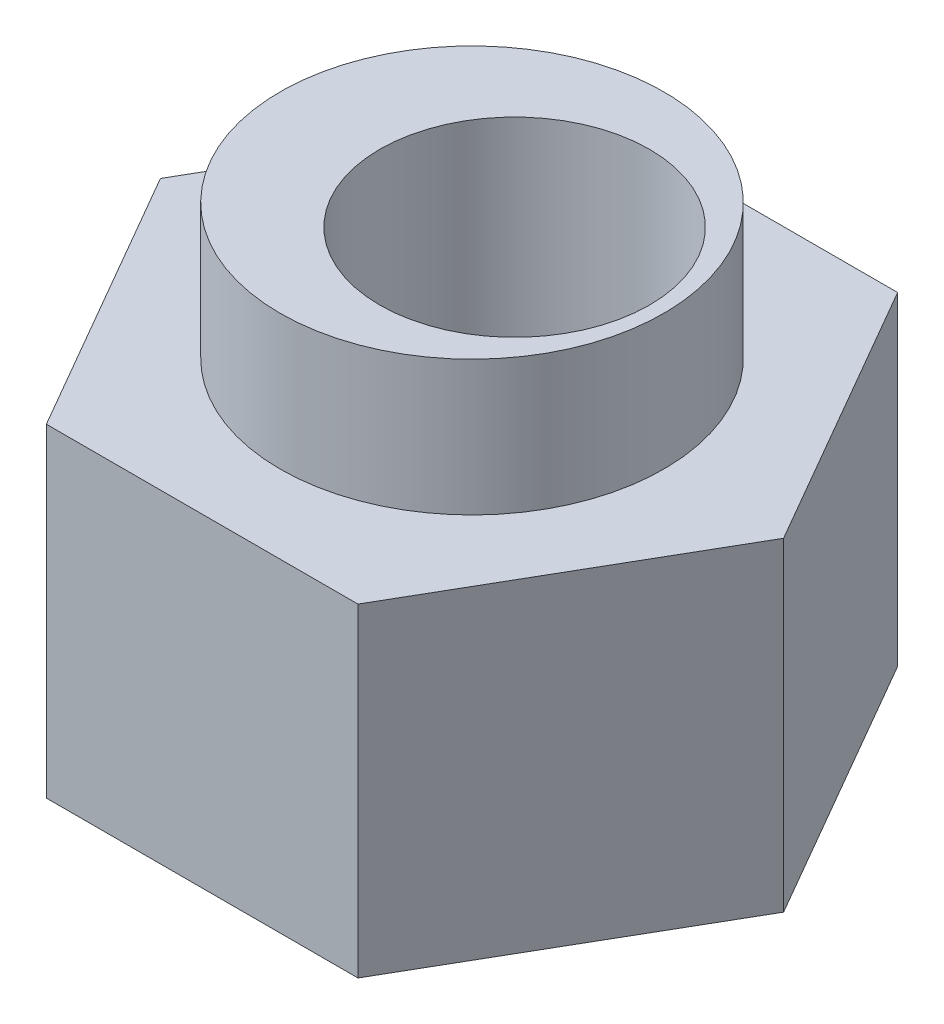
ISO-10303-21;
HEADER;
FILE_DESCRIPTION(('STEP AP214'),'2;1');
FILE_NAME('part.step','',(''),(''),'','','');
FILE_SCHEMA(('AUTOMOTIVE_DESIGN { 1 0 10303 214 1 1 1 1 }'));
ENDSEC;
DATA;
#1=APPLICATION_CONTEXT('core data for automotive mechanical design processes');
#2=APPLICATION_PROTOCOL_DEFINITION('international standard','automotive_design',2000,#1);
#3=PRODUCT_CONTEXT('',#1,'mechanical');
#4=PRODUCT('Part','Part','',(#3));
#5=PRODUCT_RELATED_PRODUCT_CATEGORY('part','',(#4));
#6=PRODUCT_DEFINITION_FORMATION('','',#4);
#7=PRODUCT_DEFINITION_CONTEXT('part definition',#1,'design');
#8=PRODUCT_DEFINITION('design','',#6,#7);
#9=PRODUCT_DEFINITION_SHAPE('','',#8);
#10=(LENGTH_UNIT() NAMED_UNIT(*) SI_UNIT(.MILLI.,.METRE.));
#11=(NAMED_UNIT(*) PLANE_ANGLE_UNIT() SI_UNIT($,.RADIAN.));
#12=(NAMED_UNIT(*) SI_UNIT($,.STERADIAN.) SOLID_ANGLE_UNIT());
#13=UNCERTAINTY_MEASURE_WITH_UNIT(LENGTH_MEASURE(1.E-05),#10,'distance_accuracy_value','');
#14=(GEOMETRIC_REPRESENTATION_CONTEXT(3) GLOBAL_UNCERTAINTY_ASSIGNED_CONTEXT((#13)) GLOBAL_UNIT_ASSIGNED_CONTEXT((#10,
#11,#12)) REPRESENTATION_CONTEXT('',''));
#15=CARTESIAN_POINT('',(0.,0.,0.));
#16=DIRECTION('',(0.,0.,1.));
#17=DIRECTION('',(1.,0.,0.));
#18=AXIS2_PLACEMENT_3D('',#15,#16,#17);
#19=CARTESIAN_POINT('',(2.52654535163238,-6.,1.45870163888475));
#20=DIRECTION('',(0.866025403784439,0.,0.499999999999999));
#21=DIRECTION('',(0.499999999999999,0.,-0.866025403784439));
#22=AXIS2_PLACEMENT_3D('',#19,#20,#21);
#23=PLANE('',#22);
#24=DIRECTION('',(0.499999999999999,0.,-0.866025403784439));
#25=VECTOR('',#24,1.);
#26=CARTESIAN_POINT('',(2.52654535163238,0.,1.45870163888475));
#27=LINE('',#26,#25);
#28=CARTESIAN_POINT('',(-0.928202951273142,0.,7.44250122687947));
#29=VERTEX_POINT('',#28);
#30=CARTESIAN_POINT('',(1.95854839467498,0.,2.44250122687947));
#31=VERTEX_POINT('',#30);
#32=EDGE_CURVE('E126',#29,#31,#27,.T.);
#33=ORIENTED_EDGE('',*,*,#32,.F.);
#34=DIRECTION('',(0.,1.,0.));
#35=VECTOR('',#34,1.);
#36=CARTESIAN_POINT('',(-0.928202951273142,-6.,7.44250122687947));
#37=LINE('',#36,#35);
#38=CARTESIAN_POINT('',(-0.928202951273142,-6.,7.44250122687947));
#39=VERTEX_POINT('',#38);
#40=EDGE_CURVE('E11',#39,#29,#37,.T.);
#41=ORIENTED_EDGE('',*,*,#40,.F.);
#42=DIRECTION('',(0.499999999999999,0.,-0.866025403784439));
#43=VECTOR('',#42,1.);
#44=CARTESIAN_POINT('',(2.52654535163238,-6.,1.45870163888475));
#45=LINE('',#44,#43);
#46=CARTESIAN_POINT('',(1.95854839467498,-6.,2.44250122687947));
#47=VERTEX_POINT('',#46);
#48=EDGE_CURVE('E141',#39,#47,#45,.T.);
#49=ORIENTED_EDGE('',*,*,#48,.T.);
#50=DIRECTION('',(0.,1.,0.));
#51=VECTOR('',#50,1.);
#52=CARTESIAN_POINT('',(1.95854839467498,-6.,2.44250122687947));
#53=LINE('',#52,#51);
#54=EDGE_CURVE('E40',#47,#31,#53,.T.);
#55=ORIENTED_EDGE('',*,*,#54,.T.);
#56=EDGE_LOOP('',(#33,#41,#49,#55));
#57=FACE_BOUND('',#56,.T.);
#58=ADVANCED_FACE('F37',(#57),#23,.T.);
#59=CARTESIAN_POINT('',(0.,-6.,7.44250122687947));
#60=DIRECTION('',(0.,0.,1.));
#61=DIRECTION('',(1.,0.,0.));
#62=AXIS2_PLACEMENT_3D('',#59,#60,#61);
#63=PLANE('',#62);
#64=DIRECTION('',(1.,0.,0.));
#65=VECTOR('',#64,1.);
#66=CARTESIAN_POINT('',(0.,0.,7.44250122687947));
#67=LINE('',#66,#65);
#68=CARTESIAN_POINT('',(-6.7017056431694,0.,7.44250122687947));
#69=VERTEX_POINT('',#68);
#70=EDGE_CURVE('E139',#69,#29,#67,.T.);
#71=ORIENTED_EDGE('',*,*,#70,.F.);
#72=DIRECTION('',(0.,1.,0.));
#73=VECTOR('',#72,1.);
#74=CARTESIAN_POINT('',(-6.7017056431694,-6.,7.44250122687947));
#75=LINE('',#74,#73);
#76=CARTESIAN_POINT('',(-6.7017056431694,-6.,7.44250122687947));
#77=VERTEX_POINT('',#76);
#78=EDGE_CURVE('E46',#77,#69,#75,.T.);
#79=ORIENTED_EDGE('',*,*,#78,.F.);
#80=DIRECTION('',(1.,0.,0.));
#81=VECTOR('',#80,1.);
#82=CARTESIAN_POINT('',(0.,-6.,7.44250122687947));
#83=LINE('',#82,#81);
#84=EDGE_CURVE('E113',#77,#39,#83,.T.);
#85=ORIENTED_EDGE('',*,*,#84,.T.);
#86=ORIENTED_EDGE('',*,*,#40,.T.);
#87=EDGE_LOOP('',(#71,#79,#85,#86));
#88=FACE_BOUND('',#87,.T.);
#89=ADVANCED_FACE('F149',(#88),#63,.T.);
#90=CARTESIAN_POINT('',(-8.24897679746429,-6.,4.76254897455499));
#91=DIRECTION('',(-0.866025403784438,0.,0.5));
#92=DIRECTION('',(0.5,0.,0.866025403784438));
#93=AXIS2_PLACEMENT_3D('',#90,#91,#92);
#94=PLANE('',#93);
#95=DIRECTION('',(0.5,0.,0.866025403784438));
#96=VECTOR('',#95,1.);
#97=CARTESIAN_POINT('',(-8.24897679746429,0.,4.76254897455499));
#98=LINE('',#97,#96);
#99=CARTESIAN_POINT('',(-9.58845698911753,0.,2.44250122687948));
#100=VERTEX_POINT('',#99);
#101=EDGE_CURVE('E99',#100,#69,#98,.T.);
#102=ORIENTED_EDGE('',*,*,#101,.F.);
#103=DIRECTION('',(0.,1.,0.));
#104=VECTOR('',#103,1.);
#105=CARTESIAN_POINT('',(-9.58845698911753,-6.,2.44250122687948));
#106=LINE('',#105,#104);
#107=CARTESIAN_POINT('',(-9.58845698911753,-6.,2.44250122687948));
#108=VERTEX_POINT('',#107);
#109=EDGE_CURVE('E94',#108,#100,#106,.T.);
#110=ORIENTED_EDGE('',*,*,#109,.F.);
#111=DIRECTION('',(0.5,0.,0.866025403784438));
#112=VECTOR('',#111,1.);
#113=CARTESIAN_POINT('',(-8.24897679746429,-6.,4.76254897455499));
#114=LINE('',#113,#112);
#115=EDGE_CURVE('E97',#108,#77,#114,.T.);
#116=ORIENTED_EDGE('',*,*,#115,.T.);
#117=ORIENTED_EDGE('',*,*,#78,.T.);
#118=EDGE_LOOP('',(#102,#110,#116,#117));
#119=FACE_BOUND('',#118,.T.);
#120=ADVANCED_FACE('F96',(#119),#94,.T.);
#121=CARTESIAN_POINT('',(-6.13370868621201,-6.,-3.54129836111525));
#122=DIRECTION('',(-0.866025403784439,0.,-0.5));
#123=DIRECTION('',(-0.5,0.,0.866025403784439));
#124=AXIS2_PLACEMENT_3D('',#121,#122,#123);
#125=PLANE('',#124);
#126=DIRECTION('',(-0.5,0.,0.866025403784439));
#127=VECTOR('',#126,1.);
#128=CARTESIAN_POINT('',(-6.13370868621201,0.,-3.54129836111525));
#129=LINE('',#128,#127);
#130=CARTESIAN_POINT('',(-6.7017056431694,0.,-2.55749877312053));
#131=VERTEX_POINT('',#130);
#132=EDGE_CURVE('E136',#131,#100,#129,.T.);
#133=ORIENTED_EDGE('',*,*,#132,.F.);
#134=DIRECTION('',(0.,1.,0.));
#135=VECTOR('',#134,1.);
#136=CARTESIAN_POINT('',(-6.7017056431694,-6.,-2.55749877312053));
#137=LINE('',#136,#135);
#138=CARTESIAN_POINT('',(-6.7017056431694,-6.,-2.55749877312053));
#139=VERTEX_POINT('',#138);
#140=EDGE_CURVE('E104',#139,#131,#137,.T.);
#141=ORIENTED_EDGE('',*,*,#140,.F.);
#142=DIRECTION('',(-0.5,0.,0.866025403784439));
#143=VECTOR('',#142,1.);
#144=CARTESIAN_POINT('',(-6.13370868621201,-6.,-3.54129836111525));
#145=LINE('',#144,#143);
#146=EDGE_CURVE('E111',#139,#108,#145,.T.);
#147=ORIENTED_EDGE('',*,*,#146,.T.);
#148=ORIENTED_EDGE('',*,*,#109,.T.);
#149=EDGE_LOOP('',(#133,#141,#147,#148));
#150=FACE_BOUND('',#149,.T.);
#151=ADVANCED_FACE('F115',(#150),#125,.T.);
#152=CARTESIAN_POINT('',(0.,-6.,-2.55749877312052));
#153=DIRECTION('',(0.,0.,-1.));
#154=DIRECTION('',(-1.,0.,0.));
#155=AXIS2_PLACEMENT_3D('',#152,#153,#154);
#156=PLANE('',#155);
#157=DIRECTION('',(-1.,0.,0.));
#158=VECTOR('',#157,1.);
#159=CARTESIAN_POINT('',(0.,0.,-2.55749877312052));
#160=LINE('',#159,#158);
#161=CARTESIAN_POINT('',(-0.928202951273149,0.,-2.55749877312052));
#162=VERTEX_POINT('',#161);
#163=EDGE_CURVE('E133',#162,#131,#160,.T.);
#164=ORIENTED_EDGE('',*,*,#163,.F.);
#165=DIRECTION('',(0.,1.,0.));
#166=VECTOR('',#165,1.);
#167=CARTESIAN_POINT('',(-0.928202951273149,-6.,-2.55749877312052));
#168=LINE('',#167,#166);
#169=CARTESIAN_POINT('',(-0.928202951273149,-6.,-2.55749877312052));
#170=VERTEX_POINT('',#169);
#171=EDGE_CURVE('E144',#170,#162,#168,.T.);
#172=ORIENTED_EDGE('',*,*,#171,.F.);
#173=DIRECTION('',(-1.,0.,0.));
#174=VECTOR('',#173,1.);
#175=CARTESIAN_POINT('',(0.,-6.,-2.55749877312052));
#176=LINE('',#175,#174);
#177=EDGE_CURVE('E116',#170,#139,#176,.T.);
#178=ORIENTED_EDGE('',*,*,#177,.T.);
#179=ORIENTED_EDGE('',*,*,#140,.T.);
#180=EDGE_LOOP('',(#164,#172,#178,#179));
#181=FACE_BOUND('',#180,.T.);
#182=ADVANCED_FACE('F163',(#181),#156,.T.);
#183=CARTESIAN_POINT('',(0.411277240380094,-6.,-0.237451025445014));
#184=DIRECTION('',(0.866025403784438,0.,-0.500000000000001));
#185=DIRECTION('',(-0.500000000000001,0.,-0.866025403784438));
#186=AXIS2_PLACEMENT_3D('',#183,#184,#185);
#187=PLANE('',#186);
#188=DIRECTION('',(-0.500000000000001,0.,-0.866025403784438));
#189=VECTOR('',#188,1.);
#190=CARTESIAN_POINT('',(0.411277240380094,0.,-0.237451025445014));
#191=LINE('',#190,#189);
#192=EDGE_CURVE('E129',#31,#162,#191,.T.);
#193=ORIENTED_EDGE('',*,*,#192,.F.);
#194=ORIENTED_EDGE('',*,*,#54,.F.);
#195=DIRECTION('',(-0.500000000000001,0.,-0.866025403784438));
#196=VECTOR('',#195,1.);
#197=CARTESIAN_POINT('',(0.411277240380094,-6.,-0.237451025445014));
#198=LINE('',#197,#196);
#199=EDGE_CURVE('E118',#47,#170,#198,.T.);
#200=ORIENTED_EDGE('',*,*,#199,.T.);
#201=ORIENTED_EDGE('',*,*,#171,.T.);
#202=EDGE_LOOP('',(#193,#194,#200,#201));
#203=FACE_BOUND('',#202,.T.);
#204=ADVANCED_FACE('F146',(#203),#187,.T.);
#205=CARTESIAN_POINT('',(-3.02495429722127,-6.,2.44250122687947));
#206=DIRECTION('',(0.,1.,0.));
#207=DIRECTION('',(0.,0.,1.));
#208=AXIS2_PLACEMENT_3D('',#205,#206,#207);
#209=CYLINDRICAL_SURFACE('',#208,2.5);
#210=CARTESIAN_POINT('',(-3.02495429722127,-6.,2.44250122687947));
#211=DIRECTION('',(0.,1.,0.));
#212=DIRECTION('',(0.,0.,1.));
#213=AXIS2_PLACEMENT_3D('',#210,#211,#212);
#214=CIRCLE('',#213,2.5);
#215=CARTESIAN_POINT('',(-3.02495429722127,-6.,4.94250122687947));
#216=VERTEX_POINT('',#215);
#217=EDGE_CURVE('E123',#216,#216,#214,.T.);
#218=ORIENTED_EDGE('',*,*,#217,.F.);
#219=EDGE_LOOP('',(#218));
#220=FACE_BOUND('',#219,.T.);
#221=CARTESIAN_POINT('',(-3.02495429722127,2.5,2.44250122687947));
#222=DIRECTION('',(0.,1.,0.));
#223=DIRECTION('',(0.,0.,1.));
#224=AXIS2_PLACEMENT_3D('',#221,#222,#223);
#225=CIRCLE('',#224,2.5);
#226=CARTESIAN_POINT('',(-3.02495429722127,2.5,4.94250122687947));
#227=VERTEX_POINT('',#226);
#228=EDGE_CURVE('E179',#227,#227,#225,.T.);
#229=ORIENTED_EDGE('',*,*,#228,.T.);
#230=EDGE_LOOP('',(#229));
#231=FACE_BOUND('',#230,.T.);
#232=ADVANCED_FACE('F158',(#220,#231),#209,.F.);
#233=CARTESIAN_POINT('',(0.,-6.,0.));
#234=DIRECTION('',(0.,1.,0.));
#235=DIRECTION('',(0.,0.,1.));
#236=AXIS2_PLACEMENT_3D('',#233,#234,#235);
#237=PLANE('',#236);
#238=ORIENTED_EDGE('',*,*,#48,.F.);
#239=ORIENTED_EDGE('',*,*,#84,.F.);
#240=ORIENTED_EDGE('',*,*,#115,.F.);
#241=ORIENTED_EDGE('',*,*,#146,.F.);
#242=ORIENTED_EDGE('',*,*,#177,.F.);
#243=ORIENTED_EDGE('',*,*,#199,.F.);
#244=EDGE_LOOP('',(#238,#239,#240,#241,#242,#243));
#245=FACE_BOUND('',#244,.T.);
#246=ORIENTED_EDGE('',*,*,#217,.T.);
#247=EDGE_LOOP('',(#246));
#248=FACE_BOUND('',#247,.T.);
#249=ADVANCED_FACE('F108',(#245,#248),#237,.F.);
#250=CARTESIAN_POINT('',(0.,0.,0.));
#251=DIRECTION('',(0.,1.,0.));
#252=DIRECTION('',(0.,0.,1.));
#253=AXIS2_PLACEMENT_3D('',#250,#251,#252);
#254=PLANE('',#253);
#255=CARTESIAN_POINT('',(-3.81495429722127,0.,2.44250122687947));
#256=DIRECTION('',(0.,1.,0.));
#257=DIRECTION('',(0.,0.,1.));
#258=AXIS2_PLACEMENT_3D('',#255,#256,#257);
#259=CIRCLE('',#258,3.555);
#260=CARTESIAN_POINT('',(-3.81495429722127,0.,5.99750122687947));
#261=VERTEX_POINT('',#260);
#262=EDGE_CURVE('E181',#261,#261,#259,.T.);
#263=ORIENTED_EDGE('',*,*,#262,.F.);
#264=EDGE_LOOP('',(#263));
#265=FACE_BOUND('',#264,.T.);
#266=ORIENTED_EDGE('',*,*,#32,.T.);
#267=ORIENTED_EDGE('',*,*,#192,.T.);
#268=ORIENTED_EDGE('',*,*,#163,.T.);
#269=ORIENTED_EDGE('',*,*,#132,.T.);
#270=ORIENTED_EDGE('',*,*,#101,.T.);
#271=ORIENTED_EDGE('',*,*,#70,.T.);
#272=EDGE_LOOP('',(#266,#267,#268,#269,#270,#271));
#273=FACE_BOUND('',#272,.T.);
#274=ADVANCED_FACE('F148',(#265,#273),#254,.T.);
#275=CARTESIAN_POINT('',(-3.81495429722127,2.5,2.44250122687947));
#276=DIRECTION('',(0.,-1.,0.));
#277=DIRECTION('',(0.,0.,-1.));
#278=AXIS2_PLACEMENT_3D('',#275,#276,#277);
#279=CYLINDRICAL_SURFACE('',#278,3.555);
#280=CARTESIAN_POINT('',(-3.81495429722127,2.5,2.44250122687947));
#281=DIRECTION('',(0.,1.,0.));
#282=DIRECTION('',(0.,0.,1.));
#283=AXIS2_PLACEMENT_3D('',#280,#281,#282);
#284=CIRCLE('',#283,3.555);
#285=CARTESIAN_POINT('',(-3.81495429722127,2.5,5.99750122687947));
#286=VERTEX_POINT('',#285);
#287=EDGE_CURVE('E130',#286,#286,#284,.T.);
#288=ORIENTED_EDGE('',*,*,#287,.F.);
#289=EDGE_LOOP('',(#288));
#290=FACE_BOUND('',#289,.T.);
#291=ORIENTED_EDGE('',*,*,#262,.T.);
#292=EDGE_LOOP('',(#291));
#293=FACE_BOUND('',#292,.T.);
#294=ADVANCED_FACE('F190',(#290,#293),#279,.T.);
#295=CARTESIAN_POINT('',(0.,2.5,0.));
#296=DIRECTION('',(0.,1.,0.));
#297=DIRECTION('',(0.,0.,1.));
#298=AXIS2_PLACEMENT_3D('',#295,#296,#297);
#299=PLANE('',#298);
#300=ORIENTED_EDGE('',*,*,#228,.F.);
#301=EDGE_LOOP('',(#300));
#302=FACE_BOUND('',#301,.T.);
#303=ORIENTED_EDGE('',*,*,#287,.T.);
#304=EDGE_LOOP('',(#303));
#305=FACE_BOUND('',#304,.T.);
#306=ADVANCED_FACE('F196',(#302,#305),#299,.T.);
#307=CLOSED_SHELL('',(#58,#89,#120,#151,#182,#204,#232,#249,#274,#294,#306));
#308=MANIFOLD_SOLID_BREP('B2',#307);
#309=ADVANCED_BREP_SHAPE_REPRESENTATION('',(#18,#308),#14);
#310=SHAPE_DEFINITION_REPRESENTATION(#9,#309);
ENDSEC;
END-ISO-10303-21;
